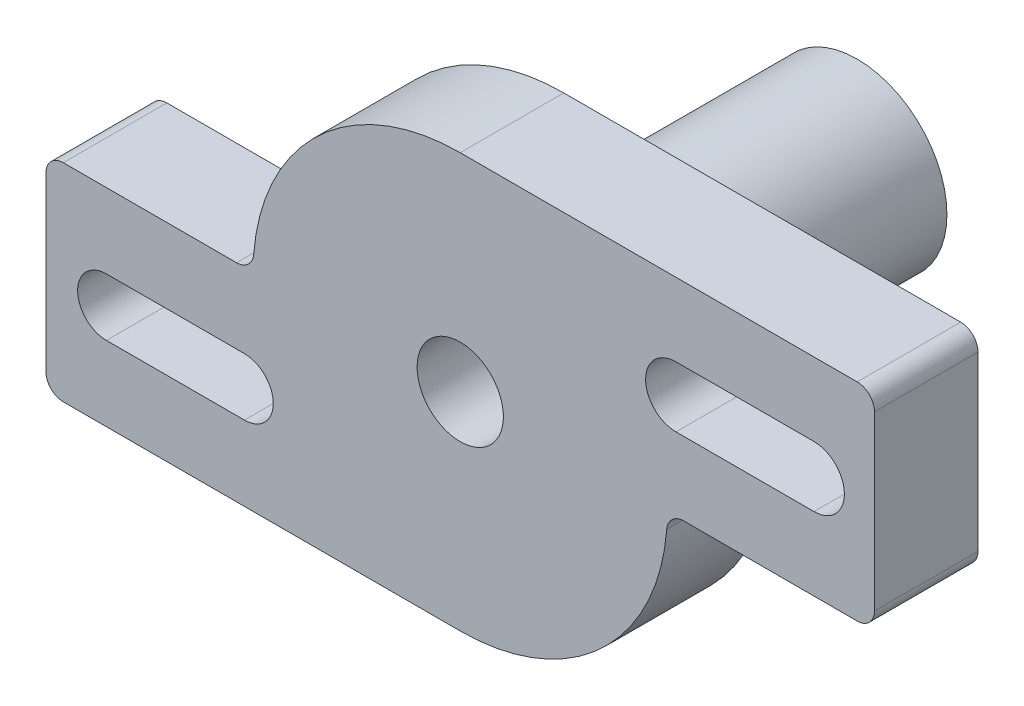
ISO-10303-21;
HEADER;
FILE_DESCRIPTION(('STEP AP214'),'2;1');
FILE_NAME('part.step','',(''),(''),'','','');
FILE_SCHEMA(('AUTOMOTIVE_DESIGN { 1 0 10303 214 1 1 1 1 }'));
ENDSEC;
DATA;
#1=APPLICATION_CONTEXT('core data for automotive mechanical design processes');
#2=APPLICATION_PROTOCOL_DEFINITION('international standard','automotive_design',2000,#1);
#3=PRODUCT_CONTEXT('',#1,'mechanical');
#4=PRODUCT('Part','Part','',(#3));
#5=PRODUCT_RELATED_PRODUCT_CATEGORY('part','',(#4));
#6=PRODUCT_DEFINITION_FORMATION('','',#4);
#7=PRODUCT_DEFINITION_CONTEXT('part definition',#1,'design');
#8=PRODUCT_DEFINITION('design','',#6,#7);
#9=PRODUCT_DEFINITION_SHAPE('','',#8);
#10=(LENGTH_UNIT() NAMED_UNIT(*) SI_UNIT(.MILLI.,.METRE.));
#11=(NAMED_UNIT(*) PLANE_ANGLE_UNIT() SI_UNIT($,.RADIAN.));
#12=(NAMED_UNIT(*) SI_UNIT($,.STERADIAN.) SOLID_ANGLE_UNIT());
#13=UNCERTAINTY_MEASURE_WITH_UNIT(LENGTH_MEASURE(1.E-05),#10,'distance_accuracy_value','');
#14=(GEOMETRIC_REPRESENTATION_CONTEXT(3) GLOBAL_UNCERTAINTY_ASSIGNED_CONTEXT((#13)) GLOBAL_UNIT_ASSIGNED_CONTEXT((#10,
#11,#12)) REPRESENTATION_CONTEXT('',''));
#15=CARTESIAN_POINT('',(0.,0.,0.));
#16=DIRECTION('',(0.,0.,1.));
#17=DIRECTION('',(1.,0.,0.));
#18=AXIS2_PLACEMENT_3D('',#15,#16,#17);
#19=CARTESIAN_POINT('',(-47.7897984071504,88.3956534963122,3.));
#20=DIRECTION('',(0.,0.,1.));
#21=DIRECTION('',(1.,0.,0.));
#22=AXIS2_PLACEMENT_3D('',#19,#20,#21);
#23=PLANE('',#22);
#24=CARTESIAN_POINT('',(-47.7897984071504,88.3956534963122,3.));
#25=DIRECTION('',(0.,0.,-1.));
#26=DIRECTION('',(-1.,0.,0.));
#27=AXIS2_PLACEMENT_3D('',#24,#25,#26);
#28=CIRCLE('',#27,1.24999999999999);
#29=CARTESIAN_POINT('',(-49.0397984071504,88.3956534963122,3.));
#30=VERTEX_POINT('',#29);
#31=EDGE_CURVE('E676',#30,#30,#28,.T.);
#32=ORIENTED_EDGE('',*,*,#31,.T.);
#33=EDGE_LOOP('',(#32));
#34=FACE_BOUND('',#33,.T.);
#35=DIRECTION('',(0.,-1.,0.));
#36=VECTOR('',#35,1.);
#37=CARTESIAN_POINT('',(-59.7897984071504,88.3956534963122,3.));
#38=LINE('',#37,#36);
#39=CARTESIAN_POINT('',(-59.7897984071504,87.8956534963122,3.));
#40=VERTEX_POINT('',#39);
#41=CARTESIAN_POINT('',(-59.7897984071504,82.8956534963122,3.));
#42=VERTEX_POINT('',#41);
#43=EDGE_CURVE('E267',#40,#42,#38,.T.);
#44=ORIENTED_EDGE('',*,*,#43,.T.);
#45=CARTESIAN_POINT('',(-59.2897984071504,82.8956534963122,3.));
#46=DIRECTION('',(0.,0.,1.));
#47=DIRECTION('',(1.,0.,0.));
#48=AXIS2_PLACEMENT_3D('',#45,#46,#47);
#49=CIRCLE('',#48,0.5);
#50=CARTESIAN_POINT('',(-59.2897984071504,82.3956534963122,3.));
#51=VERTEX_POINT('',#50);
#52=EDGE_CURVE('E331',#42,#51,#49,.T.);
#53=ORIENTED_EDGE('',*,*,#52,.T.);
#54=DIRECTION('',(1.,0.,0.));
#55=VECTOR('',#54,1.);
#56=CARTESIAN_POINT('',(-59.7897984071504,82.3956534963122,3.));
#57=LINE('',#56,#55);
#58=CARTESIAN_POINT('',(-47.7897984071504,82.3956534963122,3.));
#59=VERTEX_POINT('',#58);
#60=EDGE_CURVE('E270',#51,#59,#57,.T.);
#61=ORIENTED_EDGE('',*,*,#60,.T.);
#62=CARTESIAN_POINT('',(-47.7897984071504,88.3956534963122,3.));
#63=DIRECTION('',(0.,0.,1.));
#64=DIRECTION('',(1.,0.,0.));
#65=AXIS2_PLACEMENT_3D('',#62,#63,#64);
#66=CIRCLE('',#65,6.);
#67=CARTESIAN_POINT('',(-41.8075762240047,87.9341150347738,3.));
#68=VERTEX_POINT('',#67);
#69=EDGE_CURVE('E272',#59,#68,#66,.T.);
#70=ORIENTED_EDGE('',*,*,#69,.T.);
#71=CARTESIAN_POINT('',(-41.3090577087425,87.8956534963122,3.));
#72=DIRECTION('',(0.,0.,1.));
#73=DIRECTION('',(1.,0.,0.));
#74=AXIS2_PLACEMENT_3D('',#71,#72,#73);
#75=CIRCLE('',#74,0.5);
#76=CARTESIAN_POINT('',(-41.3090577087425,88.3956534963122,3.));
#77=VERTEX_POINT('',#76);
#78=EDGE_CURVE('E11',#68,#77,#75,.F.);
#79=ORIENTED_EDGE('',*,*,#78,.T.);
#80=DIRECTION('',(1.,0.,0.));
#81=VECTOR('',#80,1.);
#82=CARTESIAN_POINT('',(-41.7897984071504,88.3956534963122,3.));
#83=LINE('',#82,#81);
#84=CARTESIAN_POINT('',(-36.2897984071504,88.3956534963122,3.));
#85=VERTEX_POINT('',#84);
#86=EDGE_CURVE('E275',#77,#85,#83,.T.);
#87=ORIENTED_EDGE('',*,*,#86,.T.);
#88=CARTESIAN_POINT('',(-36.2897984071504,88.8956534963122,3.));
#89=DIRECTION('',(0.,0.,1.));
#90=DIRECTION('',(1.,0.,0.));
#91=AXIS2_PLACEMENT_3D('',#88,#89,#90);
#92=CIRCLE('',#91,0.5);
#93=CARTESIAN_POINT('',(-35.7897984071504,88.8956534963122,3.));
#94=VERTEX_POINT('',#93);
#95=EDGE_CURVE('E327',#85,#94,#92,.T.);
#96=ORIENTED_EDGE('',*,*,#95,.T.);
#97=DIRECTION('',(0.,1.,0.));
#98=VECTOR('',#97,1.);
#99=CARTESIAN_POINT('',(-35.7897984071504,94.3956534963122,3.));
#100=LINE('',#99,#98);
#101=CARTESIAN_POINT('',(-35.7897984071504,93.8956534963122,3.));
#102=VERTEX_POINT('',#101);
#103=EDGE_CURVE('E278',#94,#102,#100,.T.);
#104=ORIENTED_EDGE('',*,*,#103,.T.);
#105=CARTESIAN_POINT('',(-36.2897984071504,93.8956534963122,3.));
#106=DIRECTION('',(0.,0.,1.));
#107=DIRECTION('',(1.,0.,0.));
#108=AXIS2_PLACEMENT_3D('',#105,#106,#107);
#109=CIRCLE('',#108,0.5);
#110=CARTESIAN_POINT('',(-36.2897984071504,94.3956534963122,3.));
#111=VERTEX_POINT('',#110);
#112=EDGE_CURVE('E50',#102,#111,#109,.T.);
#113=ORIENTED_EDGE('',*,*,#112,.T.);
#114=DIRECTION('',(-1.,0.,0.));
#115=VECTOR('',#114,1.);
#116=CARTESIAN_POINT('',(-47.7897984071504,94.3956534963122,3.));
#117=LINE('',#116,#115);
#118=CARTESIAN_POINT('',(-47.7897984071504,94.3956534963122,3.));
#119=VERTEX_POINT('',#118);
#120=EDGE_CURVE('E280',#111,#119,#117,.T.);
#121=ORIENTED_EDGE('',*,*,#120,.T.);
#122=CARTESIAN_POINT('',(-47.7897984071504,88.3956534963122,3.));
#123=DIRECTION('',(0.,0.,1.));
#124=DIRECTION('',(1.,0.,0.));
#125=AXIS2_PLACEMENT_3D('',#122,#123,#124);
#126=CIRCLE('',#125,6.);
#127=CARTESIAN_POINT('',(-53.7720205902961,88.8571919578507,3.));
#128=VERTEX_POINT('',#127);
#129=EDGE_CURVE('E260',#119,#128,#126,.T.);
#130=ORIENTED_EDGE('',*,*,#129,.T.);
#131=CARTESIAN_POINT('',(-54.2705391055582,88.8956534963122,3.));
#132=DIRECTION('',(0.,0.,1.));
#133=DIRECTION('',(1.,0.,0.));
#134=AXIS2_PLACEMENT_3D('',#131,#132,#133);
#135=CIRCLE('',#134,0.5);
#136=CARTESIAN_POINT('',(-54.2705391055582,88.3956534963122,3.));
#137=VERTEX_POINT('',#136);
#138=EDGE_CURVE('E359',#128,#137,#135,.F.);
#139=ORIENTED_EDGE('',*,*,#138,.T.);
#140=DIRECTION('',(-1.,0.,0.));
#141=VECTOR('',#140,1.);
#142=CARTESIAN_POINT('',(-53.7897984071504,88.3956534963122,3.));
#143=LINE('',#142,#141);
#144=CARTESIAN_POINT('',(-59.2897984071504,88.3956534963122,3.));
#145=VERTEX_POINT('',#144);
#146=EDGE_CURVE('E263',#137,#145,#143,.T.);
#147=ORIENTED_EDGE('',*,*,#146,.T.);
#148=CARTESIAN_POINT('',(-59.2897984071504,87.8956534963122,3.));
#149=DIRECTION('',(0.,0.,1.));
#150=DIRECTION('',(1.,0.,0.));
#151=AXIS2_PLACEMENT_3D('',#148,#149,#150);
#152=CIRCLE('',#151,0.5);
#153=EDGE_CURVE('E329',#145,#40,#152,.T.);
#154=ORIENTED_EDGE('',*,*,#153,.T.);
#155=EDGE_LOOP('',(#44,#53,#61,#70,#79,#87,#96,#104,#113,#121,#130,#139,#147,#154));
#156=FACE_BOUND('',#155,.T.);
#157=DIRECTION('',(-1.,0.,0.));
#158=VECTOR('',#157,1.);
#159=CARTESIAN_POINT('',(-37.5397984071504,92.2746497934151,3.));
#160=LINE('',#159,#158);
#161=CARTESIAN_POINT('',(-37.5397984071504,92.2746497934151,3.));
#162=VERTEX_POINT('',#161);
#163=CARTESIAN_POINT('',(-41.5397984071504,92.2746497934151,3.));
#164=VERTEX_POINT('',#163);
#165=EDGE_CURVE('E231',#162,#164,#160,.T.);
#166=ORIENTED_EDGE('',*,*,#165,.F.);
#167=CARTESIAN_POINT('',(-37.5397984071504,91.3956534963122,3.));
#168=DIRECTION('',(0.,0.,1.));
#169=DIRECTION('',(1.,0.,0.));
#170=AXIS2_PLACEMENT_3D('',#167,#168,#169);
#171=CIRCLE('',#170,0.878996297102849);
#172=CARTESIAN_POINT('',(-37.5397984071504,90.5166571992094,3.));
#173=VERTEX_POINT('',#172);
#174=EDGE_CURVE('E229',#173,#162,#171,.T.);
#175=ORIENTED_EDGE('',*,*,#174,.F.);
#176=DIRECTION('',(1.,0.,0.));
#177=VECTOR('',#176,1.);
#178=CARTESIAN_POINT('',(-37.5397984071504,90.5166571992094,3.));
#179=LINE('',#178,#177);
#180=CARTESIAN_POINT('',(-41.5397984071504,90.5166571992094,3.));
#181=VERTEX_POINT('',#180);
#182=EDGE_CURVE('E237',#181,#173,#179,.T.);
#183=ORIENTED_EDGE('',*,*,#182,.F.);
#184=CARTESIAN_POINT('',(-41.5397984071504,91.3956534963122,3.));
#185=DIRECTION('',(0.,0.,1.));
#186=DIRECTION('',(1.,0.,0.));
#187=AXIS2_PLACEMENT_3D('',#184,#185,#186);
#188=CIRCLE('',#187,0.878996297102849);
#189=EDGE_CURVE('E234',#164,#181,#188,.T.);
#190=ORIENTED_EDGE('',*,*,#189,.F.);
#191=EDGE_LOOP('',(#166,#175,#183,#190));
#192=FACE_BOUND('',#191,.T.);
#193=DIRECTION('',(1.,0.,0.));
#194=VECTOR('',#193,1.);
#195=CARTESIAN_POINT('',(-58.0397984071504,84.5616142578735,3.));
#196=LINE('',#195,#194);
#197=CARTESIAN_POINT('',(-58.0397984071504,84.5616142578735,3.));
#198=VERTEX_POINT('',#197);
#199=CARTESIAN_POINT('',(-54.0397984071504,84.5616142578735,3.));
#200=VERTEX_POINT('',#199);
#201=EDGE_CURVE('E196',#198,#200,#196,.T.);
#202=ORIENTED_EDGE('',*,*,#201,.F.);
#203=CARTESIAN_POINT('',(-58.0397984071504,85.3956534963122,3.));
#204=DIRECTION('',(0.,0.,1.));
#205=DIRECTION('',(1.,0.,0.));
#206=AXIS2_PLACEMENT_3D('',#203,#204,#205);
#207=CIRCLE('',#206,0.83403923843868);
#208=CARTESIAN_POINT('',(-58.0397984071504,86.2296927347509,3.));
#209=VERTEX_POINT('',#208);
#210=EDGE_CURVE('E186',#209,#198,#207,.T.);
#211=ORIENTED_EDGE('',*,*,#210,.F.);
#212=DIRECTION('',(-1.,0.,0.));
#213=VECTOR('',#212,1.);
#214=CARTESIAN_POINT('',(-58.0397984071504,86.2296927347509,3.));
#215=LINE('',#214,#213);
#216=CARTESIAN_POINT('',(-54.0397984071504,86.2296927347509,3.));
#217=VERTEX_POINT('',#216);
#218=EDGE_CURVE('E211',#217,#209,#215,.T.);
#219=ORIENTED_EDGE('',*,*,#218,.F.);
#220=CARTESIAN_POINT('',(-54.0397984071504,85.3956534963122,3.));
#221=DIRECTION('',(0.,0.,1.));
#222=DIRECTION('',(1.,0.,0.));
#223=AXIS2_PLACEMENT_3D('',#220,#221,#222);
#224=CIRCLE('',#223,0.83403923843868);
#225=EDGE_CURVE('E209',#200,#217,#224,.T.);
#226=ORIENTED_EDGE('',*,*,#225,.F.);
#227=EDGE_LOOP('',(#202,#211,#219,#226));
#228=FACE_BOUND('',#227,.T.);
#229=ADVANCED_FACE('F35',(#34,#156,#192,#228),#23,.T.);
#230=CARTESIAN_POINT('',(-47.7897984071504,88.3956534963122,0.));
#231=DIRECTION('',(0.,0.,1.));
#232=DIRECTION('',(1.,0.,0.));
#233=AXIS2_PLACEMENT_3D('',#230,#231,#232);
#234=PLANE('',#233);
#235=CARTESIAN_POINT('',(-47.7897984071504,88.3956534963122,0.));
#236=DIRECTION('',(0.,0.,1.));
#237=DIRECTION('',(1.,0.,0.));
#238=AXIS2_PLACEMENT_3D('',#235,#236,#237);
#239=CIRCLE('',#238,3.1);
#240=CARTESIAN_POINT('',(-44.6897984071504,88.3956534963122,0.));
#241=VERTEX_POINT('',#240);
#242=EDGE_CURVE('E310',#241,#241,#239,.T.);
#243=ORIENTED_EDGE('',*,*,#242,.T.);
#244=EDGE_LOOP('',(#243));
#245=FACE_BOUND('',#244,.T.);
#246=CARTESIAN_POINT('',(-37.5397984071504,91.3956534963122,0.));
#247=DIRECTION('',(0.,0.,1.));
#248=DIRECTION('',(1.,0.,0.));
#249=AXIS2_PLACEMENT_3D('',#246,#247,#248);
#250=CIRCLE('',#249,0.878996297102849);
#251=CARTESIAN_POINT('',(-37.5397984071504,90.5166571992094,0.));
#252=VERTEX_POINT('',#251);
#253=CARTESIAN_POINT('',(-37.5397984071504,92.2746497934151,0.));
#254=VERTEX_POINT('',#253);
#255=EDGE_CURVE('E204',#252,#254,#250,.T.);
#256=ORIENTED_EDGE('',*,*,#255,.T.);
#257=DIRECTION('',(-1.,0.,0.));
#258=VECTOR('',#257,1.);
#259=CARTESIAN_POINT('',(-37.5397984071504,92.2746497934151,0.));
#260=LINE('',#259,#258);
#261=CARTESIAN_POINT('',(-41.5397984071504,92.2746497934151,0.));
#262=VERTEX_POINT('',#261);
#263=EDGE_CURVE('E242',#254,#262,#260,.T.);
#264=ORIENTED_EDGE('',*,*,#263,.T.);
#265=CARTESIAN_POINT('',(-41.5397984071504,91.3956534963122,0.));
#266=DIRECTION('',(0.,0.,1.));
#267=DIRECTION('',(1.,0.,0.));
#268=AXIS2_PLACEMENT_3D('',#265,#266,#267);
#269=CIRCLE('',#268,0.878996297102849);
#270=CARTESIAN_POINT('',(-41.5397984071504,90.5166571992094,0.));
#271=VERTEX_POINT('',#270);
#272=EDGE_CURVE('E245',#262,#271,#269,.T.);
#273=ORIENTED_EDGE('',*,*,#272,.T.);
#274=DIRECTION('',(1.,0.,0.));
#275=VECTOR('',#274,1.);
#276=CARTESIAN_POINT('',(-37.5397984071504,90.5166571992094,0.));
#277=LINE('',#276,#275);
#278=EDGE_CURVE('E232',#271,#252,#277,.T.);
#279=ORIENTED_EDGE('',*,*,#278,.T.);
#280=EDGE_LOOP('',(#256,#264,#273,#279));
#281=FACE_BOUND('',#280,.T.);
#282=DIRECTION('',(1.,0.,0.));
#283=VECTOR('',#282,1.);
#284=CARTESIAN_POINT('',(-59.7897984071504,82.3956534963122,0.));
#285=LINE('',#284,#283);
#286=CARTESIAN_POINT('',(-59.2897984071504,82.3956534963122,0.));
#287=VERTEX_POINT('',#286);
#288=CARTESIAN_POINT('',(-47.7897984071504,82.3956534963122,0.));
#289=VERTEX_POINT('',#288);
#290=EDGE_CURVE('E291',#287,#289,#285,.T.);
#291=ORIENTED_EDGE('',*,*,#290,.F.);
#292=CARTESIAN_POINT('',(-59.2897984071504,82.8956534963122,0.));
#293=DIRECTION('',(0.,0.,1.));
#294=DIRECTION('',(1.,0.,0.));
#295=AXIS2_PLACEMENT_3D('',#292,#293,#294);
#296=CIRCLE('',#295,0.5);
#297=CARTESIAN_POINT('',(-59.7897984071504,82.8956534963122,0.));
#298=VERTEX_POINT('',#297);
#299=EDGE_CURVE('E319',#287,#298,#296,.F.);
#300=ORIENTED_EDGE('',*,*,#299,.T.);
#301=DIRECTION('',(0.,-1.,0.));
#302=VECTOR('',#301,1.);
#303=CARTESIAN_POINT('',(-59.7897984071504,88.3956534963122,0.));
#304=LINE('',#303,#302);
#305=CARTESIAN_POINT('',(-59.7897984071504,87.8956534963122,0.));
#306=VERTEX_POINT('',#305);
#307=EDGE_CURVE('E288',#306,#298,#304,.T.);
#308=ORIENTED_EDGE('',*,*,#307,.F.);
#309=CARTESIAN_POINT('',(-59.2897984071504,87.8956534963122,0.));
#310=DIRECTION('',(0.,0.,1.));
#311=DIRECTION('',(1.,0.,0.));
#312=AXIS2_PLACEMENT_3D('',#309,#310,#311);
#313=CIRCLE('',#312,0.5);
#314=CARTESIAN_POINT('',(-59.2897984071504,88.3956534963122,0.));
#315=VERTEX_POINT('',#314);
#316=EDGE_CURVE('E317',#306,#315,#313,.F.);
#317=ORIENTED_EDGE('',*,*,#316,.T.);
#318=DIRECTION('',(-1.,0.,0.));
#319=VECTOR('',#318,1.);
#320=CARTESIAN_POINT('',(-53.7897984071504,88.3956534963122,0.));
#321=LINE('',#320,#319);
#322=CARTESIAN_POINT('',(-54.2705391055582,88.3956534963122,0.));
#323=VERTEX_POINT('',#322);
#324=EDGE_CURVE('E285',#323,#315,#321,.T.);
#325=ORIENTED_EDGE('',*,*,#324,.F.);
#326=CARTESIAN_POINT('',(-54.2705391055582,88.8956534963122,0.));
#327=DIRECTION('',(0.,0.,1.));
#328=DIRECTION('',(1.,0.,0.));
#329=AXIS2_PLACEMENT_3D('',#326,#327,#328);
#330=CIRCLE('',#329,0.5);
#331=CARTESIAN_POINT('',(-53.7720205902961,88.8571919578507,0.));
#332=VERTEX_POINT('',#331);
#333=EDGE_CURVE('E357',#323,#332,#330,.T.);
#334=ORIENTED_EDGE('',*,*,#333,.T.);
#335=CARTESIAN_POINT('',(-47.7897984071504,88.3956534963122,0.));
#336=DIRECTION('',(0.,0.,1.));
#337=DIRECTION('',(1.,0.,0.));
#338=AXIS2_PLACEMENT_3D('',#335,#336,#337);
#339=CIRCLE('',#338,6.);
#340=CARTESIAN_POINT('',(-47.7897984071504,94.3956534963122,0.));
#341=VERTEX_POINT('',#340);
#342=EDGE_CURVE('E259',#341,#332,#339,.T.);
#343=ORIENTED_EDGE('',*,*,#342,.F.);
#344=DIRECTION('',(-1.,0.,0.));
#345=VECTOR('',#344,1.);
#346=CARTESIAN_POINT('',(-47.7897984071504,94.3956534963122,0.));
#347=LINE('',#346,#345);
#348=CARTESIAN_POINT('',(-36.2897984071504,94.3956534963122,0.));
#349=VERTEX_POINT('',#348);
#350=EDGE_CURVE('E264',#349,#341,#347,.T.);
#351=ORIENTED_EDGE('',*,*,#350,.F.);
#352=CARTESIAN_POINT('',(-36.2897984071504,93.8956534963122,0.));
#353=DIRECTION('',(0.,0.,1.));
#354=DIRECTION('',(1.,0.,0.));
#355=AXIS2_PLACEMENT_3D('',#352,#353,#354);
#356=CIRCLE('',#355,0.5);
#357=CARTESIAN_POINT('',(-35.7897984071504,93.8956534963122,0.));
#358=VERTEX_POINT('',#357);
#359=EDGE_CURVE('E313',#349,#358,#356,.F.);
#360=ORIENTED_EDGE('',*,*,#359,.T.);
#361=DIRECTION('',(0.,1.,0.));
#362=VECTOR('',#361,1.);
#363=CARTESIAN_POINT('',(-35.7897984071504,94.3956534963122,0.));
#364=LINE('',#363,#362);
#365=CARTESIAN_POINT('',(-35.7897984071504,88.8956534963122,0.));
#366=VERTEX_POINT('',#365);
#367=EDGE_CURVE('E299',#366,#358,#364,.T.);
#368=ORIENTED_EDGE('',*,*,#367,.F.);
#369=CARTESIAN_POINT('',(-36.2897984071504,88.8956534963122,0.));
#370=DIRECTION('',(0.,0.,1.));
#371=DIRECTION('',(1.,0.,0.));
#372=AXIS2_PLACEMENT_3D('',#369,#370,#371);
#373=CIRCLE('',#372,0.5);
#374=CARTESIAN_POINT('',(-36.2897984071504,88.3956534963122,0.));
#375=VERTEX_POINT('',#374);
#376=EDGE_CURVE('E315',#366,#375,#373,.F.);
#377=ORIENTED_EDGE('',*,*,#376,.T.);
#378=DIRECTION('',(1.,0.,0.));
#379=VECTOR('',#378,1.);
#380=CARTESIAN_POINT('',(-41.7897984071504,88.3956534963122,0.));
#381=LINE('',#380,#379);
#382=CARTESIAN_POINT('',(-41.3090577087425,88.3956534963122,0.));
#383=VERTEX_POINT('',#382);
#384=EDGE_CURVE('E296',#383,#375,#381,.T.);
#385=ORIENTED_EDGE('',*,*,#384,.F.);
#386=CARTESIAN_POINT('',(-41.3090577087425,87.8956534963122,0.));
#387=DIRECTION('',(0.,0.,1.));
#388=DIRECTION('',(1.,0.,0.));
#389=AXIS2_PLACEMENT_3D('',#386,#387,#388);
#390=CIRCLE('',#389,0.5);
#391=CARTESIAN_POINT('',(-41.8075762240047,87.9341150347738,0.));
#392=VERTEX_POINT('',#391);
#393=EDGE_CURVE('E43',#383,#392,#390,.T.);
#394=ORIENTED_EDGE('',*,*,#393,.T.);
#395=CARTESIAN_POINT('',(-47.7897984071504,88.3956534963122,0.));
#396=DIRECTION('',(0.,0.,1.));
#397=DIRECTION('',(1.,0.,0.));
#398=AXIS2_PLACEMENT_3D('',#395,#396,#397);
#399=CIRCLE('',#398,6.);
#400=EDGE_CURVE('E293',#289,#392,#399,.T.);
#401=ORIENTED_EDGE('',*,*,#400,.F.);
#402=EDGE_LOOP('',(#291,#300,#308,#317,#325,#334,#343,#351,#360,#368,#377,#385,#394,#401));
#403=FACE_BOUND('',#402,.T.);
#404=CARTESIAN_POINT('',(-58.0397984071504,85.3956534963122,0.));
#405=DIRECTION('',(0.,0.,1.));
#406=DIRECTION('',(1.,0.,0.));
#407=AXIS2_PLACEMENT_3D('',#404,#405,#406);
#408=CIRCLE('',#407,0.83403923843868);
#409=CARTESIAN_POINT('',(-58.0397984071504,86.2296927347509,0.));
#410=VERTEX_POINT('',#409);
#411=CARTESIAN_POINT('',(-58.0397984071504,84.5616142578735,0.));
#412=VERTEX_POINT('',#411);
#413=EDGE_CURVE('E216',#410,#412,#408,.T.);
#414=ORIENTED_EDGE('',*,*,#413,.T.);
#415=DIRECTION('',(1.,0.,0.));
#416=VECTOR('',#415,1.);
#417=CARTESIAN_POINT('',(-58.0397984071504,84.5616142578735,0.));
#418=LINE('',#417,#416);
#419=CARTESIAN_POINT('',(-54.0397984071504,84.5616142578735,0.));
#420=VERTEX_POINT('',#419);
#421=EDGE_CURVE('E203',#412,#420,#418,.T.);
#422=ORIENTED_EDGE('',*,*,#421,.T.);
#423=CARTESIAN_POINT('',(-54.0397984071504,85.3956534963122,0.));
#424=DIRECTION('',(0.,0.,1.));
#425=DIRECTION('',(1.,0.,0.));
#426=AXIS2_PLACEMENT_3D('',#423,#424,#425);
#427=CIRCLE('',#426,0.83403923843868);
#428=CARTESIAN_POINT('',(-54.0397984071504,86.2296927347509,0.));
#429=VERTEX_POINT('',#428);
#430=EDGE_CURVE('E220',#420,#429,#427,.T.);
#431=ORIENTED_EDGE('',*,*,#430,.T.);
#432=DIRECTION('',(-1.,0.,0.));
#433=VECTOR('',#432,1.);
#434=CARTESIAN_POINT('',(-58.0397984071504,86.2296927347509,0.));
#435=LINE('',#434,#433);
#436=EDGE_CURVE('E197',#429,#410,#435,.T.);
#437=ORIENTED_EDGE('',*,*,#436,.T.);
#438=EDGE_LOOP('',(#414,#422,#431,#437));
#439=FACE_BOUND('',#438,.T.);
#440=ADVANCED_FACE('F364',(#245,#281,#403,#439),#234,.F.);
#441=CARTESIAN_POINT('',(-47.7897984071504,88.3956534963122,3.));
#442=DIRECTION('',(0.,0.,-1.));
#443=DIRECTION('',(-1.,0.,0.));
#444=AXIS2_PLACEMENT_3D('',#441,#442,#443);
#445=CYLINDRICAL_SURFACE('',#444,6.);
#446=ORIENTED_EDGE('',*,*,#342,.T.);
#447=DIRECTION('',(0.,0.,-1.));
#448=VECTOR('',#447,1.);
#449=CARTESIAN_POINT('',(-53.7720205902961,88.8571919578507,3.));
#450=LINE('',#449,#448);
#451=EDGE_CURVE('E338',#332,#128,#450,.F.);
#452=ORIENTED_EDGE('',*,*,#451,.T.);
#453=ORIENTED_EDGE('',*,*,#129,.F.);
#454=DIRECTION('',(0.,0.,-1.));
#455=VECTOR('',#454,1.);
#456=CARTESIAN_POINT('',(-47.7897984071504,94.3956534963122,3.));
#457=LINE('',#456,#455);
#458=EDGE_CURVE('E282',#119,#341,#457,.T.);
#459=ORIENTED_EDGE('',*,*,#458,.T.);
#460=EDGE_LOOP('',(#446,#452,#453,#459));
#461=FACE_BOUND('',#460,.T.);
#462=ADVANCED_FACE('F436',(#461),#445,.T.);
#463=CARTESIAN_POINT('',(-53.7897984071504,88.3956534963122,3.));
#464=DIRECTION('',(0.,-1.,0.));
#465=DIRECTION('',(0.,0.,-1.));
#466=AXIS2_PLACEMENT_3D('',#463,#464,#465);
#467=PLANE('',#466);
#468=ORIENTED_EDGE('',*,*,#324,.T.);
#469=DIRECTION('',(0.,0.,-1.));
#470=VECTOR('',#469,1.);
#471=CARTESIAN_POINT('',(-59.2897984071504,88.3956534963122,3.));
#472=LINE('',#471,#470);
#473=EDGE_CURVE('E336',#315,#145,#472,.F.);
#474=ORIENTED_EDGE('',*,*,#473,.T.);
#475=ORIENTED_EDGE('',*,*,#146,.F.);
#476=DIRECTION('',(0.,0.,1.));
#477=VECTOR('',#476,1.);
#478=CARTESIAN_POINT('',(-54.2705391055582,88.3956534963122,0.));
#479=LINE('',#478,#477);
#480=EDGE_CURVE('E333',#137,#323,#479,.F.);
#481=ORIENTED_EDGE('',*,*,#480,.T.);
#482=EDGE_LOOP('',(#468,#474,#475,#481));
#483=FACE_BOUND('',#482,.T.);
#484=ADVANCED_FACE('F404',(#483),#467,.F.);
#485=CARTESIAN_POINT('',(-59.7897984071504,88.3956534963122,3.));
#486=DIRECTION('',(1.,0.,0.));
#487=DIRECTION('',(0.,0.,-1.));
#488=AXIS2_PLACEMENT_3D('',#485,#486,#487);
#489=PLANE('',#488);
#490=ORIENTED_EDGE('',*,*,#307,.T.);
#491=DIRECTION('',(0.,0.,-1.));
#492=VECTOR('',#491,1.);
#493=CARTESIAN_POINT('',(-59.7897984071504,82.8956534963122,3.));
#494=LINE('',#493,#492);
#495=EDGE_CURVE('E324',#298,#42,#494,.F.);
#496=ORIENTED_EDGE('',*,*,#495,.T.);
#497=ORIENTED_EDGE('',*,*,#43,.F.);
#498=DIRECTION('',(0.,0.,-1.));
#499=VECTOR('',#498,1.);
#500=CARTESIAN_POINT('',(-59.7897984071504,87.8956534963122,3.));
#501=LINE('',#500,#499);
#502=EDGE_CURVE('E321',#40,#306,#501,.T.);
#503=ORIENTED_EDGE('',*,*,#502,.T.);
#504=EDGE_LOOP('',(#490,#496,#497,#503));
#505=FACE_BOUND('',#504,.T.);
#506=ADVANCED_FACE('F413',(#505),#489,.F.);
#507=CARTESIAN_POINT('',(-59.7897984071504,82.3956534963122,3.));
#508=DIRECTION('',(0.,1.,0.));
#509=DIRECTION('',(0.,0.,1.));
#510=AXIS2_PLACEMENT_3D('',#507,#508,#509);
#511=PLANE('',#510);
#512=ORIENTED_EDGE('',*,*,#60,.F.);
#513=DIRECTION('',(0.,0.,-1.));
#514=VECTOR('',#513,1.);
#515=CARTESIAN_POINT('',(-59.2897984071504,82.3956534963122,3.));
#516=LINE('',#515,#514);
#517=EDGE_CURVE('E307',#51,#287,#516,.T.);
#518=ORIENTED_EDGE('',*,*,#517,.T.);
#519=ORIENTED_EDGE('',*,*,#290,.T.);
#520=DIRECTION('',(0.,0.,-1.));
#521=VECTOR('',#520,1.);
#522=CARTESIAN_POINT('',(-47.7897984071504,82.3956534963122,3.));
#523=LINE('',#522,#521);
#524=EDGE_CURVE('E304',#59,#289,#523,.T.);
#525=ORIENTED_EDGE('',*,*,#524,.F.);
#526=EDGE_LOOP('',(#512,#518,#519,#525));
#527=FACE_BOUND('',#526,.T.);
#528=ADVANCED_FACE('F421',(#527),#511,.F.);
#529=CARTESIAN_POINT('',(-47.7897984071504,88.3956534963122,3.));
#530=DIRECTION('',(0.,0.,-1.));
#531=DIRECTION('',(-1.,0.,0.));
#532=AXIS2_PLACEMENT_3D('',#529,#530,#531);
#533=CYLINDRICAL_SURFACE('',#532,6.);
#534=ORIENTED_EDGE('',*,*,#400,.T.);
#535=DIRECTION('',(0.,0.,-1.));
#536=VECTOR('',#535,1.);
#537=CARTESIAN_POINT('',(-41.8075762240047,87.9341150347738,3.));
#538=LINE('',#537,#536);
#539=EDGE_CURVE('E345',#392,#68,#538,.F.);
#540=ORIENTED_EDGE('',*,*,#539,.T.);
#541=ORIENTED_EDGE('',*,*,#69,.F.);
#542=ORIENTED_EDGE('',*,*,#524,.T.);
#543=EDGE_LOOP('',(#534,#540,#541,#542));
#544=FACE_BOUND('',#543,.T.);
#545=ADVANCED_FACE('F370',(#544),#533,.T.);
#546=CARTESIAN_POINT('',(-41.7897984071504,88.3956534963122,3.));
#547=DIRECTION('',(0.,1.,0.));
#548=DIRECTION('',(0.,0.,1.));
#549=AXIS2_PLACEMENT_3D('',#546,#547,#548);
#550=PLANE('',#549);
#551=ORIENTED_EDGE('',*,*,#86,.F.);
#552=DIRECTION('',(0.,0.,1.));
#553=VECTOR('',#552,1.);
#554=CARTESIAN_POINT('',(-41.3090577087425,88.3956534963122,0.));
#555=LINE('',#554,#553);
#556=EDGE_CURVE('E342',#77,#383,#555,.F.);
#557=ORIENTED_EDGE('',*,*,#556,.T.);
#558=ORIENTED_EDGE('',*,*,#384,.T.);
#559=DIRECTION('',(0.,0.,-1.));
#560=VECTOR('',#559,1.);
#561=CARTESIAN_POINT('',(-36.2897984071504,88.3956534963122,3.));
#562=LINE('',#561,#560);
#563=EDGE_CURVE('E340',#375,#85,#562,.F.);
#564=ORIENTED_EDGE('',*,*,#563,.T.);
#565=EDGE_LOOP('',(#551,#557,#558,#564));
#566=FACE_BOUND('',#565,.T.);
#567=ADVANCED_FACE('F379',(#566),#550,.F.);
#568=CARTESIAN_POINT('',(-35.7897984071504,94.3956534963122,3.));
#569=DIRECTION('',(-1.,0.,0.));
#570=DIRECTION('',(0.,-1.,0.));
#571=AXIS2_PLACEMENT_3D('',#568,#569,#570);
#572=PLANE('',#571);
#573=ORIENTED_EDGE('',*,*,#103,.F.);
#574=DIRECTION('',(0.,0.,-1.));
#575=VECTOR('',#574,1.);
#576=CARTESIAN_POINT('',(-35.7897984071504,88.8956534963122,3.));
#577=LINE('',#576,#575);
#578=EDGE_CURVE('E348',#94,#366,#577,.T.);
#579=ORIENTED_EDGE('',*,*,#578,.T.);
#580=ORIENTED_EDGE('',*,*,#367,.T.);
#581=DIRECTION('',(0.,0.,-1.));
#582=VECTOR('',#581,1.);
#583=CARTESIAN_POINT('',(-35.7897984071504,93.8956534963122,3.));
#584=LINE('',#583,#582);
#585=EDGE_CURVE('E58',#358,#102,#584,.F.);
#586=ORIENTED_EDGE('',*,*,#585,.T.);
#587=EDGE_LOOP('',(#573,#579,#580,#586));
#588=FACE_BOUND('',#587,.T.);
#589=ADVANCED_FACE('F384',(#588),#572,.F.);
#590=CARTESIAN_POINT('',(-47.7897984071504,94.3956534963122,3.));
#591=DIRECTION('',(0.,-1.,0.));
#592=DIRECTION('',(0.,0.,-1.));
#593=AXIS2_PLACEMENT_3D('',#590,#591,#592);
#594=PLANE('',#593);
#595=ORIENTED_EDGE('',*,*,#120,.F.);
#596=DIRECTION('',(0.,0.,-1.));
#597=VECTOR('',#596,1.);
#598=CARTESIAN_POINT('',(-36.2897984071504,94.3956534963122,3.));
#599=LINE('',#598,#597);
#600=EDGE_CURVE('E351',#111,#349,#599,.T.);
#601=ORIENTED_EDGE('',*,*,#600,.T.);
#602=ORIENTED_EDGE('',*,*,#350,.T.);
#603=ORIENTED_EDGE('',*,*,#458,.F.);
#604=EDGE_LOOP('',(#595,#601,#602,#603));
#605=FACE_BOUND('',#604,.T.);
#606=ADVANCED_FACE('F392',(#605),#594,.F.);
#607=CARTESIAN_POINT('',(-37.5397984071504,91.3956534963122,3.));
#608=DIRECTION('',(0.,0.,-1.));
#609=DIRECTION('',(-1.,0.,0.));
#610=AXIS2_PLACEMENT_3D('',#607,#608,#609);
#611=CYLINDRICAL_SURFACE('',#610,0.878996297102849);
#612=ORIENTED_EDGE('',*,*,#255,.F.);
#613=DIRECTION('',(0.,0.,-1.));
#614=VECTOR('',#613,1.);
#615=CARTESIAN_POINT('',(-37.5397984071504,90.5166571992094,3.));
#616=LINE('',#615,#614);
#617=EDGE_CURVE('E239',#173,#252,#616,.T.);
#618=ORIENTED_EDGE('',*,*,#617,.F.);
#619=ORIENTED_EDGE('',*,*,#174,.T.);
#620=DIRECTION('',(0.,0.,-1.));
#621=VECTOR('',#620,1.);
#622=CARTESIAN_POINT('',(-37.5397984071504,92.2746497934151,3.));
#623=LINE('',#622,#621);
#624=EDGE_CURVE('E256',#162,#254,#623,.T.);
#625=ORIENTED_EDGE('',*,*,#624,.T.);
#626=EDGE_LOOP('',(#612,#618,#619,#625));
#627=FACE_BOUND('',#626,.T.);
#628=ADVANCED_FACE('F441',(#627),#611,.F.);
#629=CARTESIAN_POINT('',(-37.5397984071504,92.2746497934151,3.));
#630=DIRECTION('',(0.,-1.,0.));
#631=DIRECTION('',(0.,0.,-1.));
#632=AXIS2_PLACEMENT_3D('',#629,#630,#631);
#633=PLANE('',#632);
#634=ORIENTED_EDGE('',*,*,#263,.F.);
#635=ORIENTED_EDGE('',*,*,#624,.F.);
#636=ORIENTED_EDGE('',*,*,#165,.T.);
#637=DIRECTION('',(0.,0.,-1.));
#638=VECTOR('',#637,1.);
#639=CARTESIAN_POINT('',(-41.5397984071504,92.2746497934151,3.));
#640=LINE('',#639,#638);
#641=EDGE_CURVE('E254',#164,#262,#640,.T.);
#642=ORIENTED_EDGE('',*,*,#641,.T.);
#643=EDGE_LOOP('',(#634,#635,#636,#642));
#644=FACE_BOUND('',#643,.T.);
#645=ADVANCED_FACE('F468',(#644),#633,.T.);
#646=CARTESIAN_POINT('',(-41.5397984071504,91.3956534963122,3.));
#647=DIRECTION('',(0.,0.,-1.));
#648=DIRECTION('',(-1.,0.,0.));
#649=AXIS2_PLACEMENT_3D('',#646,#647,#648);
#650=CYLINDRICAL_SURFACE('',#649,0.878996297102849);
#651=ORIENTED_EDGE('',*,*,#272,.F.);
#652=ORIENTED_EDGE('',*,*,#641,.F.);
#653=ORIENTED_EDGE('',*,*,#189,.T.);
#654=DIRECTION('',(0.,0.,-1.));
#655=VECTOR('',#654,1.);
#656=CARTESIAN_POINT('',(-41.5397984071504,90.5166571992094,3.));
#657=LINE('',#656,#655);
#658=EDGE_CURVE('E252',#181,#271,#657,.T.);
#659=ORIENTED_EDGE('',*,*,#658,.T.);
#660=EDGE_LOOP('',(#651,#652,#653,#659));
#661=FACE_BOUND('',#660,.T.);
#662=ADVANCED_FACE('F475',(#661),#650,.F.);
#663=CARTESIAN_POINT('',(-37.5397984071504,90.5166571992094,3.));
#664=DIRECTION('',(0.,1.,0.));
#665=DIRECTION('',(0.,0.,1.));
#666=AXIS2_PLACEMENT_3D('',#663,#664,#665);
#667=PLANE('',#666);
#668=ORIENTED_EDGE('',*,*,#278,.F.);
#669=ORIENTED_EDGE('',*,*,#658,.F.);
#670=ORIENTED_EDGE('',*,*,#182,.T.);
#671=ORIENTED_EDGE('',*,*,#617,.T.);
#672=EDGE_LOOP('',(#668,#669,#670,#671));
#673=FACE_BOUND('',#672,.T.);
#674=ADVANCED_FACE('F482',(#673),#667,.T.);
#675=CARTESIAN_POINT('',(-58.0397984071504,85.3956534963122,3.));
#676=DIRECTION('',(0.,0.,-1.));
#677=DIRECTION('',(-1.,0.,0.));
#678=AXIS2_PLACEMENT_3D('',#675,#676,#677);
#679=CYLINDRICAL_SURFACE('',#678,0.83403923843868);
#680=ORIENTED_EDGE('',*,*,#413,.F.);
#681=DIRECTION('',(0.,0.,-1.));
#682=VECTOR('',#681,1.);
#683=CARTESIAN_POINT('',(-58.0397984071504,86.2296927347509,3.));
#684=LINE('',#683,#682);
#685=EDGE_CURVE('E192',#209,#410,#684,.T.);
#686=ORIENTED_EDGE('',*,*,#685,.F.);
#687=ORIENTED_EDGE('',*,*,#210,.T.);
#688=DIRECTION('',(0.,0.,-1.));
#689=VECTOR('',#688,1.);
#690=CARTESIAN_POINT('',(-58.0397984071504,84.5616142578735,3.));
#691=LINE('',#690,#689);
#692=EDGE_CURVE('E189',#198,#412,#691,.T.);
#693=ORIENTED_EDGE('',*,*,#692,.T.);
#694=EDGE_LOOP('',(#680,#686,#687,#693));
#695=FACE_BOUND('',#694,.T.);
#696=ADVANCED_FACE('F188',(#695),#679,.F.);
#697=CARTESIAN_POINT('',(-58.0397984071504,84.5616142578735,3.));
#698=DIRECTION('',(0.,1.,0.));
#699=DIRECTION('',(0.,0.,1.));
#700=AXIS2_PLACEMENT_3D('',#697,#698,#699);
#701=PLANE('',#700);
#702=ORIENTED_EDGE('',*,*,#421,.F.);
#703=ORIENTED_EDGE('',*,*,#692,.F.);
#704=ORIENTED_EDGE('',*,*,#201,.T.);
#705=DIRECTION('',(0.,0.,-1.));
#706=VECTOR('',#705,1.);
#707=CARTESIAN_POINT('',(-54.0397984071504,84.5616142578735,3.));
#708=LINE('',#707,#706);
#709=EDGE_CURVE('E205',#200,#420,#708,.T.);
#710=ORIENTED_EDGE('',*,*,#709,.T.);
#711=EDGE_LOOP('',(#702,#703,#704,#710));
#712=FACE_BOUND('',#711,.T.);
#713=ADVANCED_FACE('F200',(#712),#701,.T.);
#714=CARTESIAN_POINT('',(-54.0397984071504,85.3956534963122,3.));
#715=DIRECTION('',(0.,0.,-1.));
#716=DIRECTION('',(-1.,0.,0.));
#717=AXIS2_PLACEMENT_3D('',#714,#715,#716);
#718=CYLINDRICAL_SURFACE('',#717,0.83403923843868);
#719=ORIENTED_EDGE('',*,*,#430,.F.);
#720=ORIENTED_EDGE('',*,*,#709,.F.);
#721=ORIENTED_EDGE('',*,*,#225,.T.);
#722=DIRECTION('',(0.,0.,-1.));
#723=VECTOR('',#722,1.);
#724=CARTESIAN_POINT('',(-54.0397984071504,86.2296927347509,3.));
#725=LINE('',#724,#723);
#726=EDGE_CURVE('E226',#217,#429,#725,.T.);
#727=ORIENTED_EDGE('',*,*,#726,.T.);
#728=EDGE_LOOP('',(#719,#720,#721,#727));
#729=FACE_BOUND('',#728,.T.);
#730=ADVANCED_FACE('F503',(#729),#718,.F.);
#731=CARTESIAN_POINT('',(-58.0397984071504,86.2296927347509,3.));
#732=DIRECTION('',(0.,-1.,0.));
#733=DIRECTION('',(0.,0.,-1.));
#734=AXIS2_PLACEMENT_3D('',#731,#732,#733);
#735=PLANE('',#734);
#736=ORIENTED_EDGE('',*,*,#436,.F.);
#737=ORIENTED_EDGE('',*,*,#726,.F.);
#738=ORIENTED_EDGE('',*,*,#218,.T.);
#739=ORIENTED_EDGE('',*,*,#685,.T.);
#740=EDGE_LOOP('',(#736,#737,#738,#739));
#741=FACE_BOUND('',#740,.T.);
#742=ADVANCED_FACE('F510',(#741),#735,.T.);
#743=CARTESIAN_POINT('',(-47.7897984071504,88.3956534963122,-8.5));
#744=DIRECTION('',(0.,0.,1.));
#745=DIRECTION('',(1.,0.,0.));
#746=AXIS2_PLACEMENT_3D('',#743,#744,#745);
#747=CYLINDRICAL_SURFACE('',#746,2.6);
#748=CARTESIAN_POINT('',(-47.7897984071504,88.3956534963122,-0.5));
#749=DIRECTION('',(0.,0.,1.));
#750=DIRECTION('',(1.,0.,0.));
#751=AXIS2_PLACEMENT_3D('',#748,#749,#750);
#752=CIRCLE('',#751,2.6);
#753=CARTESIAN_POINT('',(-45.1897984071504,88.3956534963122,-0.5));
#754=VERTEX_POINT('',#753);
#755=EDGE_CURVE('E354',#754,#754,#752,.F.);
#756=ORIENTED_EDGE('',*,*,#755,.T.);
#757=EDGE_LOOP('',(#756));
#758=FACE_BOUND('',#757,.T.);
#759=CARTESIAN_POINT('',(-47.7897984071504,88.3956534963122,-8.5));
#760=DIRECTION('',(0.,0.,-1.));
#761=DIRECTION('',(-1.,0.,0.));
#762=AXIS2_PLACEMENT_3D('',#759,#760,#761);
#763=CIRCLE('',#762,2.6);
#764=CARTESIAN_POINT('',(-50.3897984071504,88.3956534963122,-8.5));
#765=VERTEX_POINT('',#764);
#766=EDGE_CURVE('E218',#765,#765,#763,.T.);
#767=ORIENTED_EDGE('',*,*,#766,.F.);
#768=EDGE_LOOP('',(#767));
#769=FACE_BOUND('',#768,.T.);
#770=ADVANCED_FACE('F518',(#758,#769),#747,.T.);
#771=CARTESIAN_POINT('',(-47.7897984071504,88.3956534963122,-8.5));
#772=DIRECTION('',(0.,0.,-1.));
#773=DIRECTION('',(-1.,0.,0.));
#774=AXIS2_PLACEMENT_3D('',#771,#772,#773);
#775=PLANE('',#774);
#776=CARTESIAN_POINT('',(-47.7897984071504,88.3956534963122,-8.5));
#777=DIRECTION('',(0.,0.,-1.));
#778=DIRECTION('',(-1.,0.,0.));
#779=AXIS2_PLACEMENT_3D('',#776,#777,#778);
#780=CIRCLE('',#779,1.24999999999999);
#781=CARTESIAN_POINT('',(-49.0397984071504,88.3956534963122,-8.5));
#782=VERTEX_POINT('',#781);
#783=EDGE_CURVE('E677',#782,#782,#780,.T.);
#784=ORIENTED_EDGE('',*,*,#783,.F.);
#785=EDGE_LOOP('',(#784));
#786=FACE_BOUND('',#785,.T.);
#787=ORIENTED_EDGE('',*,*,#766,.T.);
#788=EDGE_LOOP('',(#787));
#789=FACE_BOUND('',#788,.T.);
#790=ADVANCED_FACE('F526',(#786,#789),#775,.T.);
#791=CARTESIAN_POINT('',(-47.7897984071504,88.3956534963122,-8.5));
#792=DIRECTION('',(0.,0.,-1.));
#793=DIRECTION('',(-1.,0.,0.));
#794=AXIS2_PLACEMENT_3D('',#791,#792,#793);
#795=CYLINDRICAL_SURFACE('',#794,1.24999999999999);
#796=ORIENTED_EDGE('',*,*,#31,.F.);
#797=EDGE_LOOP('',(#796));
#798=FACE_BOUND('',#797,.T.);
#799=ORIENTED_EDGE('',*,*,#783,.T.);
#800=EDGE_LOOP('',(#799));
#801=FACE_BOUND('',#800,.T.);
#802=ADVANCED_FACE('F534',(#798,#801),#795,.F.);
#803=CARTESIAN_POINT('',(-59.2897984071504,82.8956534963122,3.));
#804=DIRECTION('',(0.,0.,-1.));
#805=DIRECTION('',(-1.,0.,0.));
#806=AXIS2_PLACEMENT_3D('',#803,#804,#805);
#807=CYLINDRICAL_SURFACE('',#806,0.5);
#808=ORIENTED_EDGE('',*,*,#52,.F.);
#809=ORIENTED_EDGE('',*,*,#495,.F.);
#810=ORIENTED_EDGE('',*,*,#299,.F.);
#811=ORIENTED_EDGE('',*,*,#517,.F.);
#812=EDGE_LOOP('',(#808,#809,#810,#811));
#813=FACE_BOUND('',#812,.T.);
#814=ADVANCED_FACE('F419',(#813),#807,.T.);
#815=CARTESIAN_POINT('',(-59.2897984071504,87.8956534963122,3.));
#816=DIRECTION('',(0.,0.,-1.));
#817=DIRECTION('',(-1.,0.,0.));
#818=AXIS2_PLACEMENT_3D('',#815,#816,#817);
#819=CYLINDRICAL_SURFACE('',#818,0.5);
#820=ORIENTED_EDGE('',*,*,#153,.F.);
#821=ORIENTED_EDGE('',*,*,#473,.F.);
#822=ORIENTED_EDGE('',*,*,#316,.F.);
#823=ORIENTED_EDGE('',*,*,#502,.F.);
#824=EDGE_LOOP('',(#820,#821,#822,#823));
#825=FACE_BOUND('',#824,.T.);
#826=ADVANCED_FACE('F410',(#825),#819,.T.);
#827=CARTESIAN_POINT('',(-54.2705391055582,88.8956534963122,3.));
#828=DIRECTION('',(0.,0.,-1.));
#829=DIRECTION('',(-1.,0.,0.));
#830=AXIS2_PLACEMENT_3D('',#827,#828,#829);
#831=CYLINDRICAL_SURFACE('',#830,0.5);
#832=ORIENTED_EDGE('',*,*,#138,.F.);
#833=ORIENTED_EDGE('',*,*,#451,.F.);
#834=ORIENTED_EDGE('',*,*,#333,.F.);
#835=ORIENTED_EDGE('',*,*,#480,.F.);
#836=EDGE_LOOP('',(#832,#833,#834,#835));
#837=FACE_BOUND('',#836,.T.);
#838=ADVANCED_FACE('F401',(#837),#831,.F.);
#839=CARTESIAN_POINT('',(-41.3090577087425,87.8956534963122,3.));
#840=DIRECTION('',(0.,0.,-1.));
#841=DIRECTION('',(-1.,0.,0.));
#842=AXIS2_PLACEMENT_3D('',#839,#840,#841);
#843=CYLINDRICAL_SURFACE('',#842,0.5);
#844=ORIENTED_EDGE('',*,*,#78,.F.);
#845=ORIENTED_EDGE('',*,*,#539,.F.);
#846=ORIENTED_EDGE('',*,*,#393,.F.);
#847=ORIENTED_EDGE('',*,*,#556,.F.);
#848=EDGE_LOOP('',(#844,#845,#846,#847));
#849=FACE_BOUND('',#848,.T.);
#850=ADVANCED_FACE('F374',(#849),#843,.F.);
#851=CARTESIAN_POINT('',(-36.2897984071504,88.8956534963122,3.));
#852=DIRECTION('',(0.,0.,-1.));
#853=DIRECTION('',(-1.,0.,0.));
#854=AXIS2_PLACEMENT_3D('',#851,#852,#853);
#855=CYLINDRICAL_SURFACE('',#854,0.5);
#856=ORIENTED_EDGE('',*,*,#95,.F.);
#857=ORIENTED_EDGE('',*,*,#563,.F.);
#858=ORIENTED_EDGE('',*,*,#376,.F.);
#859=ORIENTED_EDGE('',*,*,#578,.F.);
#860=EDGE_LOOP('',(#856,#857,#858,#859));
#861=FACE_BOUND('',#860,.T.);
#862=ADVANCED_FACE('F382',(#861),#855,.T.);
#863=CARTESIAN_POINT('',(-36.2897984071504,93.8956534963122,3.));
#864=DIRECTION('',(0.,0.,-1.));
#865=DIRECTION('',(-1.,0.,0.));
#866=AXIS2_PLACEMENT_3D('',#863,#864,#865);
#867=CYLINDRICAL_SURFACE('',#866,0.5);
#868=ORIENTED_EDGE('',*,*,#112,.F.);
#869=ORIENTED_EDGE('',*,*,#585,.F.);
#870=ORIENTED_EDGE('',*,*,#359,.F.);
#871=ORIENTED_EDGE('',*,*,#600,.F.);
#872=EDGE_LOOP('',(#868,#869,#870,#871));
#873=FACE_BOUND('',#872,.T.);
#874=ADVANCED_FACE('F390',(#873),#867,.T.);
#875=CARTESIAN_POINT('',(-47.7897984071504,88.3956534963122,-0.5));
#876=DIRECTION('',(0.,0.,1.));
#877=DIRECTION('',(1.,0.,0.));
#878=AXIS2_PLACEMENT_3D('',#875,#876,#877);
#879=TOROIDAL_SURFACE('',#878,3.1,0.5);
#880=ORIENTED_EDGE('',*,*,#242,.F.);
#881=EDGE_LOOP('',(#880));
#882=FACE_BOUND('',#881,.T.);
#883=ORIENTED_EDGE('',*,*,#755,.F.);
#884=EDGE_LOOP('',(#883));
#885=FACE_BOUND('',#884,.T.);
#886=ADVANCED_FACE('F37',(#882,#885),#879,.F.);
#887=CLOSED_SHELL('',(#229,#440,#462,#484,#506,#528,#545,#567,#589,#606,#628,#645,#662,#674,
#696,#713,#730,#742,#770,#790,#802,#814,#826,#838,#850,#862,#874,#886));
#888=MANIFOLD_SOLID_BREP('B2',#887);
#889=ADVANCED_BREP_SHAPE_REPRESENTATION('',(#18,#888),#14);
#890=SHAPE_DEFINITION_REPRESENTATION(#9,#889);
ENDSEC;
END-ISO-10303-21;
